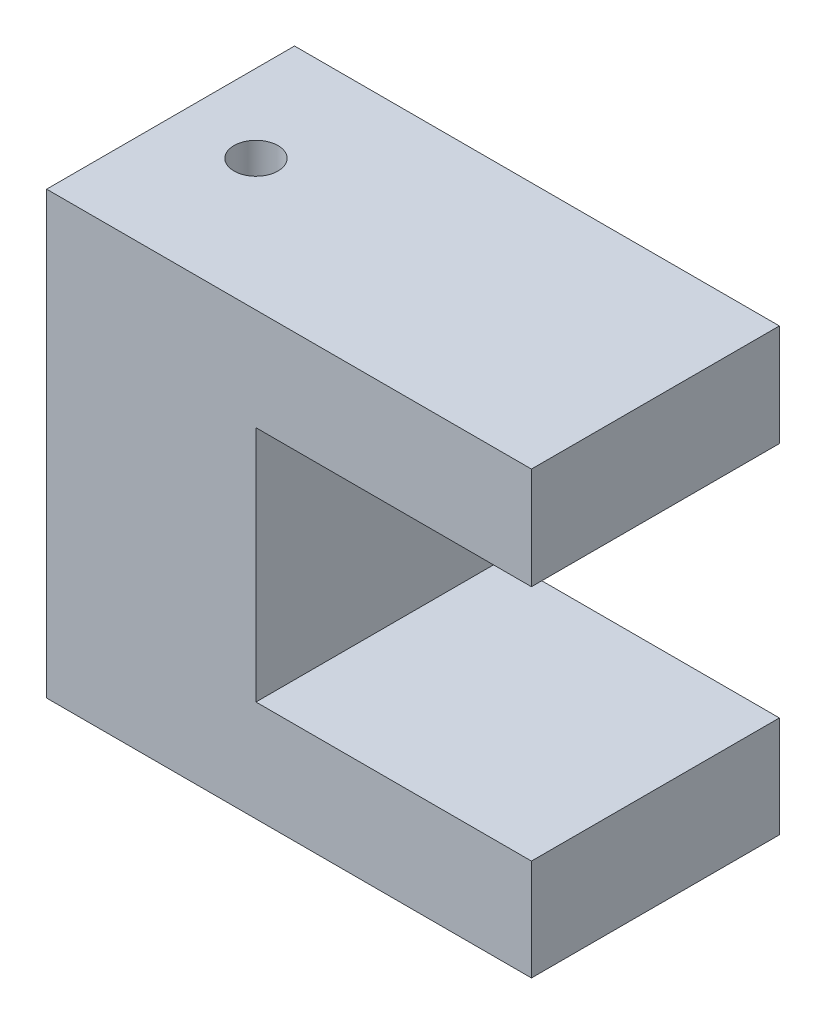
ISO-10303-21;
HEADER;
FILE_DESCRIPTION(('STEP AP214'),'2;1');
FILE_NAME('part.step','',(''),(''),'','','');
FILE_SCHEMA(('AUTOMOTIVE_DESIGN { 1 0 10303 214 1 1 1 1 }'));
ENDSEC;
DATA;
#1=APPLICATION_CONTEXT('core data for automotive mechanical design processes');
#2=APPLICATION_PROTOCOL_DEFINITION('international standard','automotive_design',2000,#1);
#3=PRODUCT_CONTEXT('',#1,'mechanical');
#4=PRODUCT('Part','Part','',(#3));
#5=PRODUCT_RELATED_PRODUCT_CATEGORY('part','',(#4));
#6=PRODUCT_DEFINITION_FORMATION('','',#4);
#7=PRODUCT_DEFINITION_CONTEXT('part definition',#1,'design');
#8=PRODUCT_DEFINITION('design','',#6,#7);
#9=PRODUCT_DEFINITION_SHAPE('','',#8);
#10=(LENGTH_UNIT() NAMED_UNIT(*) SI_UNIT(.MILLI.,.METRE.));
#11=(NAMED_UNIT(*) PLANE_ANGLE_UNIT() SI_UNIT($,.RADIAN.));
#12=(NAMED_UNIT(*) SI_UNIT($,.STERADIAN.) SOLID_ANGLE_UNIT());
#13=UNCERTAINTY_MEASURE_WITH_UNIT(LENGTH_MEASURE(1.E-05),#10,'distance_accuracy_value','');
#14=(GEOMETRIC_REPRESENTATION_CONTEXT(3) GLOBAL_UNCERTAINTY_ASSIGNED_CONTEXT((#13)) GLOBAL_UNIT_ASSIGNED_CONTEXT((#10,
#11,#12)) REPRESENTATION_CONTEXT('',''));
#15=CARTESIAN_POINT('',(0.,0.,0.));
#16=DIRECTION('',(0.,0.,1.));
#17=DIRECTION('',(1.,0.,0.));
#18=AXIS2_PLACEMENT_3D('',#15,#16,#17);
#19=CARTESIAN_POINT('',(44.,40.,45.));
#20=DIRECTION('',(-1.,0.,0.));
#21=DIRECTION('',(0.,-1.,0.));
#22=AXIS2_PLACEMENT_3D('',#19,#20,#21);
#23=PLANE('',#22);
#24=DIRECTION('',(0.,1.,0.));
#25=VECTOR('',#24,1.);
#26=CARTESIAN_POINT('',(44.,40.,0.));
#27=LINE('',#26,#25);
#28=CARTESIAN_POINT('',(44.,-40.,0.));
#29=VERTEX_POINT('',#28);
#30=CARTESIAN_POINT('',(44.,-21.6190635109829,0.));
#31=VERTEX_POINT('',#30);
#32=EDGE_CURVE('E122',#29,#31,#27,.T.);
#33=ORIENTED_EDGE('',*,*,#32,.T.);
#34=DIRECTION('',(0.,0.,1.));
#35=VECTOR('',#34,1.);
#36=CARTESIAN_POINT('',(44.,-21.6190635109829,0.));
#37=LINE('',#36,#35);
#38=CARTESIAN_POINT('',(44.,-21.6190635109829,45.));
#39=VERTEX_POINT('',#38);
#40=EDGE_CURVE('E149',#31,#39,#37,.T.);
#41=ORIENTED_EDGE('',*,*,#40,.T.);
#42=DIRECTION('',(0.,1.,0.));
#43=VECTOR('',#42,1.);
#44=CARTESIAN_POINT('',(44.,40.,45.));
#45=LINE('',#44,#43);
#46=CARTESIAN_POINT('',(44.,-40.,45.));
#47=VERTEX_POINT('',#46);
#48=EDGE_CURVE('E134',#47,#39,#45,.T.);
#49=ORIENTED_EDGE('',*,*,#48,.F.);
#50=DIRECTION('',(0.,0.,-1.));
#51=VECTOR('',#50,1.);
#52=CARTESIAN_POINT('',(44.,-40.,45.));
#53=LINE('',#52,#51);
#54=EDGE_CURVE('E133',#47,#29,#53,.T.);
#55=ORIENTED_EDGE('',*,*,#54,.T.);
#56=EDGE_LOOP('',(#33,#41,#49,#55));
#57=FACE_BOUND('',#56,.T.);
#58=ADVANCED_FACE('F33',(#57),#23,.F.);
#59=CARTESIAN_POINT('',(44.,40.,45.));
#60=DIRECTION('',(0.,-1.,0.));
#61=DIRECTION('',(0.,0.,-1.));
#62=AXIS2_PLACEMENT_3D('',#59,#60,#61);
#63=PLANE('',#62);
#64=CARTESIAN_POINT('',(-29.8500000000001,40.,21.15));
#65=DIRECTION('',(0.,1.,0.));
#66=DIRECTION('',(0.,0.,1.));
#67=AXIS2_PLACEMENT_3D('',#64,#65,#66);
#68=CIRCLE('',#67,4.00297173984812);
#69=CARTESIAN_POINT('',(-29.8500000000001,40.,25.1529717398481));
#70=VERTEX_POINT('',#69);
#71=EDGE_CURVE('E175',#70,#70,#68,.T.);
#72=ORIENTED_EDGE('',*,*,#71,.F.);
#73=EDGE_LOOP('',(#72));
#74=FACE_BOUND('',#73,.T.);
#75=DIRECTION('',(-1.,0.,0.));
#76=VECTOR('',#75,1.);
#77=CARTESIAN_POINT('',(44.,40.,0.));
#78=LINE('',#77,#76);
#79=CARTESIAN_POINT('',(44.,40.,0.));
#80=VERTEX_POINT('',#79);
#81=CARTESIAN_POINT('',(-44.,40.,0.));
#82=VERTEX_POINT('',#81);
#83=EDGE_CURVE('E121',#80,#82,#78,.T.);
#84=ORIENTED_EDGE('',*,*,#83,.T.);
#85=DIRECTION('',(0.,0.,-1.));
#86=VECTOR('',#85,1.);
#87=CARTESIAN_POINT('',(-44.,40.,45.));
#88=LINE('',#87,#86);
#89=CARTESIAN_POINT('',(-44.,40.,45.));
#90=VERTEX_POINT('',#89);
#91=EDGE_CURVE('E11',#90,#82,#88,.T.);
#92=ORIENTED_EDGE('',*,*,#91,.F.);
#93=DIRECTION('',(-1.,0.,0.));
#94=VECTOR('',#93,1.);
#95=CARTESIAN_POINT('',(44.,40.,45.));
#96=LINE('',#95,#94);
#97=CARTESIAN_POINT('',(44.,40.,45.));
#98=VERTEX_POINT('',#97);
#99=EDGE_CURVE('E126',#98,#90,#96,.T.);
#100=ORIENTED_EDGE('',*,*,#99,.F.);
#101=DIRECTION('',(0.,0.,-1.));
#102=VECTOR('',#101,1.);
#103=CARTESIAN_POINT('',(44.,40.,45.));
#104=LINE('',#103,#102);
#105=EDGE_CURVE('E131',#98,#80,#104,.T.);
#106=ORIENTED_EDGE('',*,*,#105,.T.);
#107=EDGE_LOOP('',(#84,#92,#100,#106));
#108=FACE_BOUND('',#107,.T.);
#109=ADVANCED_FACE('F35',(#74,#108),#63,.F.);
#110=CARTESIAN_POINT('',(-44.,40.,45.));
#111=DIRECTION('',(1.,0.,0.));
#112=DIRECTION('',(0.,0.,-1.));
#113=AXIS2_PLACEMENT_3D('',#110,#111,#112);
#114=PLANE('',#113);
#115=DIRECTION('',(0.,-1.,0.));
#116=VECTOR('',#115,1.);
#117=CARTESIAN_POINT('',(-44.,40.,0.));
#118=LINE('',#117,#116);
#119=CARTESIAN_POINT('',(-44.,-40.,0.));
#120=VERTEX_POINT('',#119);
#121=EDGE_CURVE('E127',#82,#120,#118,.T.);
#122=ORIENTED_EDGE('',*,*,#121,.T.);
#123=DIRECTION('',(0.,0.,-1.));
#124=VECTOR('',#123,1.);
#125=CARTESIAN_POINT('',(-44.,-40.,45.));
#126=LINE('',#125,#124);
#127=CARTESIAN_POINT('',(-44.,-40.,45.));
#128=VERTEX_POINT('',#127);
#129=EDGE_CURVE('E41',#128,#120,#126,.T.);
#130=ORIENTED_EDGE('',*,*,#129,.F.);
#131=DIRECTION('',(0.,-1.,0.));
#132=VECTOR('',#131,1.);
#133=CARTESIAN_POINT('',(-44.,40.,45.));
#134=LINE('',#133,#132);
#135=EDGE_CURVE('E86',#90,#128,#134,.T.);
#136=ORIENTED_EDGE('',*,*,#135,.F.);
#137=ORIENTED_EDGE('',*,*,#91,.T.);
#138=EDGE_LOOP('',(#122,#130,#136,#137));
#139=FACE_BOUND('',#138,.T.);
#140=ADVANCED_FACE('F156',(#139),#114,.F.);
#141=CARTESIAN_POINT('',(-44.,-40.,45.));
#142=DIRECTION('',(0.,1.,0.));
#143=DIRECTION('',(0.,0.,1.));
#144=AXIS2_PLACEMENT_3D('',#141,#142,#143);
#145=PLANE('',#144);
#146=CARTESIAN_POINT('',(-29.8500000000001,-40.,21.15));
#147=DIRECTION('',(0.,1.,0.));
#148=DIRECTION('',(0.,0.,1.));
#149=AXIS2_PLACEMENT_3D('',#146,#147,#148);
#150=CIRCLE('',#149,4.00297173984812);
#151=CARTESIAN_POINT('',(-29.8500000000001,-40.,25.1529717398481));
#152=VERTEX_POINT('',#151);
#153=EDGE_CURVE('E172',#152,#152,#150,.T.);
#154=ORIENTED_EDGE('',*,*,#153,.T.);
#155=EDGE_LOOP('',(#154));
#156=FACE_BOUND('',#155,.T.);
#157=DIRECTION('',(1.,0.,0.));
#158=VECTOR('',#157,1.);
#159=CARTESIAN_POINT('',(-44.,-40.,0.));
#160=LINE('',#159,#158);
#161=EDGE_CURVE('E123',#120,#29,#160,.T.);
#162=ORIENTED_EDGE('',*,*,#161,.T.);
#163=ORIENTED_EDGE('',*,*,#54,.F.);
#164=DIRECTION('',(1.,0.,0.));
#165=VECTOR('',#164,1.);
#166=CARTESIAN_POINT('',(-44.,-40.,45.));
#167=LINE('',#166,#165);
#168=EDGE_CURVE('E142',#128,#47,#167,.T.);
#169=ORIENTED_EDGE('',*,*,#168,.F.);
#170=ORIENTED_EDGE('',*,*,#129,.T.);
#171=EDGE_LOOP('',(#162,#163,#169,#170));
#172=FACE_BOUND('',#171,.T.);
#173=ADVANCED_FACE('F140',(#156,#172),#145,.F.);
#174=CARTESIAN_POINT('',(44.,21.4999999999988,45.));
#175=VERTEX_POINT('',#174);
#176=EDGE_CURVE('E57',#175,#98,#45,.T.);
#177=ORIENTED_EDGE('',*,*,#176,.F.);
#178=DIRECTION('',(0.,0.,1.));
#179=VECTOR('',#178,1.);
#180=CARTESIAN_POINT('',(44.,21.4999999999988,0.));
#181=LINE('',#180,#179);
#182=CARTESIAN_POINT('',(44.,21.4999999999988,0.));
#183=VERTEX_POINT('',#182);
#184=EDGE_CURVE('E110',#183,#175,#181,.T.);
#185=ORIENTED_EDGE('',*,*,#184,.F.);
#186=EDGE_CURVE('E79',#183,#80,#27,.T.);
#187=ORIENTED_EDGE('',*,*,#186,.T.);
#188=ORIENTED_EDGE('',*,*,#105,.F.);
#189=EDGE_LOOP('',(#177,#185,#187,#188));
#190=FACE_BOUND('',#189,.T.);
#191=ADVANCED_FACE('F115',(#190),#23,.F.);
#192=CARTESIAN_POINT('',(0.,0.,45.));
#193=DIRECTION('',(0.,0.,1.));
#194=DIRECTION('',(1.,0.,0.));
#195=AXIS2_PLACEMENT_3D('',#192,#193,#194);
#196=PLANE('',#195);
#197=DIRECTION('',(1.,0.,0.));
#198=VECTOR('',#197,1.);
#199=CARTESIAN_POINT('',(44.,-21.6190635109829,45.));
#200=LINE('',#199,#198);
#201=CARTESIAN_POINT('',(-6.00000000000001,-21.6190635109829,45.));
#202=VERTEX_POINT('',#201);
#203=EDGE_CURVE('E113',#202,#39,#200,.T.);
#204=ORIENTED_EDGE('',*,*,#203,.F.);
#205=DIRECTION('',(0.,-1.,0.));
#206=VECTOR('',#205,1.);
#207=CARTESIAN_POINT('',(-5.99999999999999,21.4999999999988,45.));
#208=LINE('',#207,#206);
#209=CARTESIAN_POINT('',(-5.99999999999999,21.4999999999988,45.));
#210=VERTEX_POINT('',#209);
#211=EDGE_CURVE('E167',#210,#202,#208,.T.);
#212=ORIENTED_EDGE('',*,*,#211,.F.);
#213=DIRECTION('',(-1.,0.,0.));
#214=VECTOR('',#213,1.);
#215=CARTESIAN_POINT('',(44.,21.4999999999988,45.));
#216=LINE('',#215,#214);
#217=EDGE_CURVE('E170',#175,#210,#216,.T.);
#218=ORIENTED_EDGE('',*,*,#217,.F.);
#219=ORIENTED_EDGE('',*,*,#176,.T.);
#220=ORIENTED_EDGE('',*,*,#99,.T.);
#221=ORIENTED_EDGE('',*,*,#135,.T.);
#222=ORIENTED_EDGE('',*,*,#168,.T.);
#223=ORIENTED_EDGE('',*,*,#48,.T.);
#224=EDGE_LOOP('',(#204,#212,#218,#219,#220,#221,#222,#223));
#225=FACE_BOUND('',#224,.T.);
#226=ADVANCED_FACE('F199',(#225),#196,.T.);
#227=CARTESIAN_POINT('',(0.,0.,0.));
#228=DIRECTION('',(0.,0.,1.));
#229=DIRECTION('',(1.,0.,0.));
#230=AXIS2_PLACEMENT_3D('',#227,#228,#229);
#231=PLANE('',#230);
#232=DIRECTION('',(0.,-1.,0.));
#233=VECTOR('',#232,1.);
#234=CARTESIAN_POINT('',(-5.99999999999999,21.4999999999988,0.));
#235=LINE('',#234,#233);
#236=CARTESIAN_POINT('',(-5.99999999999999,21.4999999999988,0.));
#237=VERTEX_POINT('',#236);
#238=CARTESIAN_POINT('',(-6.00000000000001,-21.6190635109829,0.));
#239=VERTEX_POINT('',#238);
#240=EDGE_CURVE('E48',#237,#239,#235,.T.);
#241=ORIENTED_EDGE('',*,*,#240,.T.);
#242=DIRECTION('',(1.,0.,0.));
#243=VECTOR('',#242,1.);
#244=CARTESIAN_POINT('',(44.,-21.6190635109829,0.));
#245=LINE('',#244,#243);
#246=EDGE_CURVE('E116',#239,#31,#245,.T.);
#247=ORIENTED_EDGE('',*,*,#246,.T.);
#248=ORIENTED_EDGE('',*,*,#32,.F.);
#249=ORIENTED_EDGE('',*,*,#161,.F.);
#250=ORIENTED_EDGE('',*,*,#121,.F.);
#251=ORIENTED_EDGE('',*,*,#83,.F.);
#252=ORIENTED_EDGE('',*,*,#186,.F.);
#253=DIRECTION('',(-1.,0.,0.));
#254=VECTOR('',#253,1.);
#255=CARTESIAN_POINT('',(44.,21.4999999999988,0.));
#256=LINE('',#255,#254);
#257=EDGE_CURVE('E107',#183,#237,#256,.T.);
#258=ORIENTED_EDGE('',*,*,#257,.T.);
#259=EDGE_LOOP('',(#241,#247,#248,#249,#250,#251,#252,#258));
#260=FACE_BOUND('',#259,.T.);
#261=ADVANCED_FACE('F119',(#260),#231,.F.);
#262=CARTESIAN_POINT('',(44.,-21.6190635109829,0.));
#263=DIRECTION('',(0.,-1.,0.));
#264=DIRECTION('',(1.,0.,0.));
#265=AXIS2_PLACEMENT_3D('',#262,#263,#264);
#266=PLANE('',#265);
#267=ORIENTED_EDGE('',*,*,#203,.T.);
#268=ORIENTED_EDGE('',*,*,#40,.F.);
#269=ORIENTED_EDGE('',*,*,#246,.F.);
#270=DIRECTION('',(0.,0.,1.));
#271=VECTOR('',#270,1.);
#272=CARTESIAN_POINT('',(-6.00000000000001,-21.6190635109829,0.));
#273=LINE('',#272,#271);
#274=EDGE_CURVE('E163',#239,#202,#273,.T.);
#275=ORIENTED_EDGE('',*,*,#274,.T.);
#276=EDGE_LOOP('',(#267,#268,#269,#275));
#277=FACE_BOUND('',#276,.T.);
#278=ADVANCED_FACE('F237',(#277),#266,.F.);
#279=CARTESIAN_POINT('',(-5.99999999999999,21.4999999999988,0.));
#280=DIRECTION('',(-1.,0.,0.));
#281=DIRECTION('',(0.,-1.,0.));
#282=AXIS2_PLACEMENT_3D('',#279,#280,#281);
#283=PLANE('',#282);
#284=ORIENTED_EDGE('',*,*,#211,.T.);
#285=ORIENTED_EDGE('',*,*,#274,.F.);
#286=ORIENTED_EDGE('',*,*,#240,.F.);
#287=DIRECTION('',(0.,0.,1.));
#288=VECTOR('',#287,1.);
#289=CARTESIAN_POINT('',(-5.99999999999999,21.4999999999988,0.));
#290=LINE('',#289,#288);
#291=EDGE_CURVE('E111',#237,#210,#290,.T.);
#292=ORIENTED_EDGE('',*,*,#291,.T.);
#293=EDGE_LOOP('',(#284,#285,#286,#292));
#294=FACE_BOUND('',#293,.T.);
#295=ADVANCED_FACE('F244',(#294),#283,.F.);
#296=CARTESIAN_POINT('',(44.,21.4999999999988,0.));
#297=DIRECTION('',(0.,1.,0.));
#298=DIRECTION('',(-1.,0.,0.));
#299=AXIS2_PLACEMENT_3D('',#296,#297,#298);
#300=PLANE('',#299);
#301=ORIENTED_EDGE('',*,*,#217,.T.);
#302=ORIENTED_EDGE('',*,*,#291,.F.);
#303=ORIENTED_EDGE('',*,*,#257,.F.);
#304=ORIENTED_EDGE('',*,*,#184,.T.);
#305=EDGE_LOOP('',(#301,#302,#303,#304));
#306=FACE_BOUND('',#305,.T.);
#307=ADVANCED_FACE('F109',(#306),#300,.F.);
#308=CARTESIAN_POINT('',(-29.8500000000001,-40.,21.15));
#309=DIRECTION('',(0.,1.,0.));
#310=DIRECTION('',(0.,0.,1.));
#311=AXIS2_PLACEMENT_3D('',#308,#309,#310);
#312=CYLINDRICAL_SURFACE('',#311,4.00297173984812);
#313=ORIENTED_EDGE('',*,*,#153,.F.);
#314=EDGE_LOOP('',(#313));
#315=FACE_BOUND('',#314,.T.);
#316=ORIENTED_EDGE('',*,*,#71,.T.);
#317=EDGE_LOOP('',(#316));
#318=FACE_BOUND('',#317,.T.);
#319=ADVANCED_FACE('F182',(#315,#318),#312,.F.);
#320=CLOSED_SHELL('',(#58,#109,#140,#173,#191,#226,#261,#278,#295,#307,#319));
#321=MANIFOLD_SOLID_BREP('B2',#320);
#322=ADVANCED_BREP_SHAPE_REPRESENTATION('',(#18,#321),#14);
#323=SHAPE_DEFINITION_REPRESENTATION(#9,#322);
ENDSEC;
END-ISO-10303-21;
